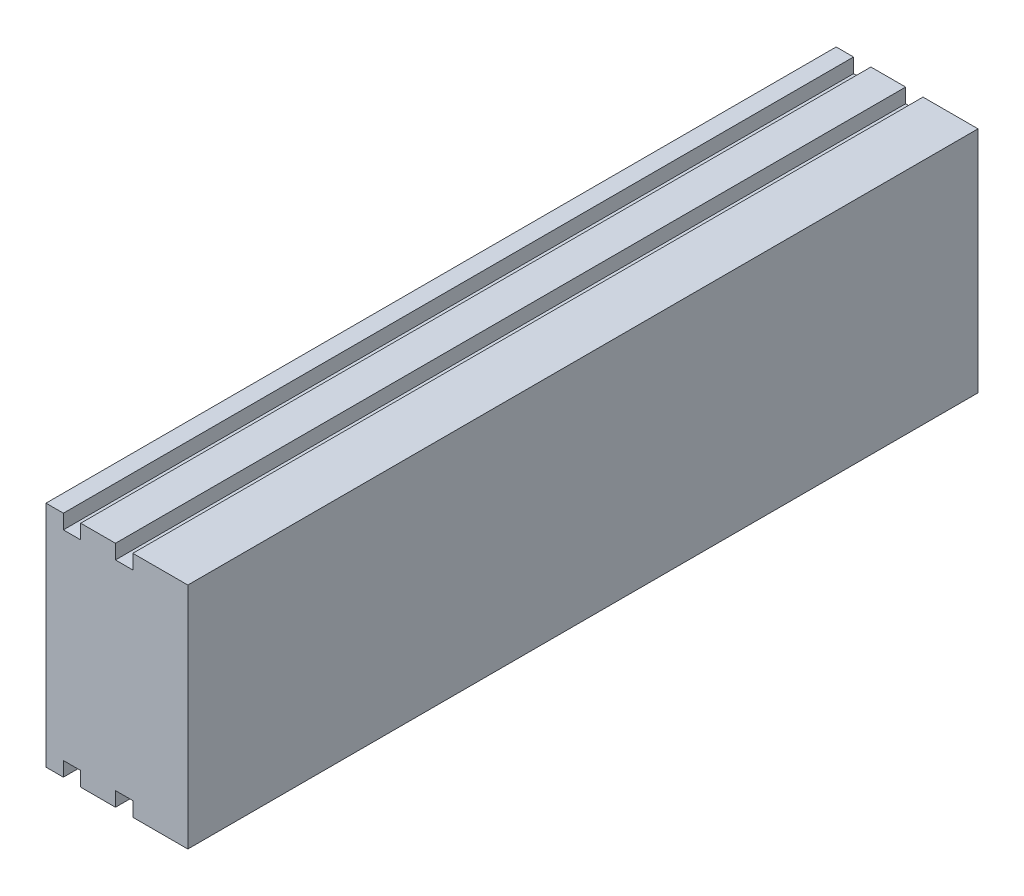
ISO-10303-21;
HEADER;
FILE_DESCRIPTION(('STEP AP214'),'2;1');
FILE_NAME('part.step','',(''),(''),'','','');
FILE_SCHEMA(('AUTOMOTIVE_DESIGN { 1 0 10303 214 1 1 1 1 }'));
ENDSEC;
DATA;
#1=APPLICATION_CONTEXT('core data for automotive mechanical design processes');
#2=APPLICATION_PROTOCOL_DEFINITION('international standard','automotive_design',2000,#1);
#3=PRODUCT_CONTEXT('',#1,'mechanical');
#4=PRODUCT('Part','Part','',(#3));
#5=PRODUCT_RELATED_PRODUCT_CATEGORY('part','',(#4));
#6=PRODUCT_DEFINITION_FORMATION('','',#4);
#7=PRODUCT_DEFINITION_CONTEXT('part definition',#1,'design');
#8=PRODUCT_DEFINITION('design','',#6,#7);
#9=PRODUCT_DEFINITION_SHAPE('','',#8);
#10=(LENGTH_UNIT() NAMED_UNIT(*) SI_UNIT(.MILLI.,.METRE.));
#11=(NAMED_UNIT(*) PLANE_ANGLE_UNIT() SI_UNIT($,.RADIAN.));
#12=(NAMED_UNIT(*) SI_UNIT($,.STERADIAN.) SOLID_ANGLE_UNIT());
#13=UNCERTAINTY_MEASURE_WITH_UNIT(LENGTH_MEASURE(1.E-05),#10,'distance_accuracy_value','');
#14=(GEOMETRIC_REPRESENTATION_CONTEXT(3) GLOBAL_UNCERTAINTY_ASSIGNED_CONTEXT((#13)) GLOBAL_UNIT_ASSIGNED_CONTEXT((#10,
#11,#12)) REPRESENTATION_CONTEXT('',''));
#15=CARTESIAN_POINT('',(0.,0.,0.));
#16=DIRECTION('',(0.,0.,1.));
#17=DIRECTION('',(1.,0.,0.));
#18=AXIS2_PLACEMENT_3D('',#15,#16,#17);
#19=CARTESIAN_POINT('',(0.,79.,273.));
#20=DIRECTION('',(0.,-1.,0.));
#21=DIRECTION('',(0.,0.,-1.));
#22=AXIS2_PLACEMENT_3D('',#19,#20,#21);
#23=PLANE('',#22);
#24=DIRECTION('',(0.,0.,-1.));
#25=VECTOR('',#24,1.);
#26=CARTESIAN_POINT('',(6.,79.,273.));
#27=LINE('',#26,#25);
#28=CARTESIAN_POINT('',(6.,79.,273.));
#29=VERTEX_POINT('',#28);
#30=CARTESIAN_POINT('',(6.00000000000003,79.,0.));
#31=VERTEX_POINT('',#30);
#32=EDGE_CURVE('E183',#29,#31,#27,.T.);
#33=ORIENTED_EDGE('',*,*,#32,.T.);
#34=DIRECTION('',(-1.,0.,0.));
#35=VECTOR('',#34,1.);
#36=CARTESIAN_POINT('',(0.,79.,0.));
#37=LINE('',#36,#35);
#38=CARTESIAN_POINT('',(0.,79.,0.));
#39=VERTEX_POINT('',#38);
#40=EDGE_CURVE('E361',#31,#39,#37,.T.);
#41=ORIENTED_EDGE('',*,*,#40,.T.);
#42=DIRECTION('',(0.,0.,-1.));
#43=VECTOR('',#42,1.);
#44=CARTESIAN_POINT('',(0.,79.,273.));
#45=LINE('',#44,#43);
#46=CARTESIAN_POINT('',(0.,79.,273.));
#47=VERTEX_POINT('',#46);
#48=EDGE_CURVE('E347',#47,#39,#45,.T.);
#49=ORIENTED_EDGE('',*,*,#48,.F.);
#50=DIRECTION('',(-1.,0.,0.));
#51=VECTOR('',#50,1.);
#52=CARTESIAN_POINT('',(0.,79.,273.));
#53=LINE('',#52,#51);
#54=EDGE_CURVE('E342',#29,#47,#53,.T.);
#55=ORIENTED_EDGE('',*,*,#54,.F.);
#56=EDGE_LOOP('',(#33,#41,#49,#55));
#57=FACE_BOUND('',#56,.T.);
#58=ADVANCED_FACE('F39',(#57),#23,.F.);
#59=DIRECTION('',(0.,0.,1.));
#60=VECTOR('',#59,1.);
#61=CARTESIAN_POINT('',(12.,79.,273.));
#62=LINE('',#61,#60);
#63=CARTESIAN_POINT('',(12.,79.,0.));
#64=VERTEX_POINT('',#63);
#65=CARTESIAN_POINT('',(12.,79.,273.));
#66=VERTEX_POINT('',#65);
#67=EDGE_CURVE('E196',#64,#66,#62,.T.);
#68=ORIENTED_EDGE('',*,*,#67,.T.);
#69=CARTESIAN_POINT('',(24.,79.,273.));
#70=VERTEX_POINT('',#69);
#71=EDGE_CURVE('E348',#70,#66,#53,.T.);
#72=ORIENTED_EDGE('',*,*,#71,.F.);
#73=DIRECTION('',(0.,0.,-1.));
#74=VECTOR('',#73,1.);
#75=CARTESIAN_POINT('',(24.,79.,273.));
#76=LINE('',#75,#74);
#77=CARTESIAN_POINT('',(24.,79.,0.));
#78=VERTEX_POINT('',#77);
#79=EDGE_CURVE('E239',#70,#78,#76,.T.);
#80=ORIENTED_EDGE('',*,*,#79,.T.);
#81=EDGE_CURVE('E365',#78,#64,#37,.T.);
#82=ORIENTED_EDGE('',*,*,#81,.T.);
#83=EDGE_LOOP('',(#68,#72,#80,#82));
#84=FACE_BOUND('',#83,.T.);
#85=ADVANCED_FACE('F423',(#84),#23,.F.);
#86=DIRECTION('',(0.,0.,1.));
#87=VECTOR('',#86,1.);
#88=CARTESIAN_POINT('',(30.,79.,273.));
#89=LINE('',#88,#87);
#90=CARTESIAN_POINT('',(30.,79.,0.));
#91=VERTEX_POINT('',#90);
#92=CARTESIAN_POINT('',(30.,79.,273.));
#93=VERTEX_POINT('',#92);
#94=EDGE_CURVE('E228',#91,#93,#89,.T.);
#95=ORIENTED_EDGE('',*,*,#94,.T.);
#96=CARTESIAN_POINT('',(49.,79.,273.));
#97=VERTEX_POINT('',#96);
#98=EDGE_CURVE('E343',#97,#93,#53,.T.);
#99=ORIENTED_EDGE('',*,*,#98,.F.);
#100=DIRECTION('',(0.,0.,-1.));
#101=VECTOR('',#100,1.);
#102=CARTESIAN_POINT('',(49.,79.,273.));
#103=LINE('',#102,#101);
#104=CARTESIAN_POINT('',(49.,79.,0.));
#105=VERTEX_POINT('',#104);
#106=EDGE_CURVE('E369',#97,#105,#103,.T.);
#107=ORIENTED_EDGE('',*,*,#106,.T.);
#108=EDGE_CURVE('E333',#105,#91,#37,.T.);
#109=ORIENTED_EDGE('',*,*,#108,.T.);
#110=EDGE_LOOP('',(#95,#99,#107,#109));
#111=FACE_BOUND('',#110,.T.);
#112=ADVANCED_FACE('F389',(#111),#23,.F.);
#113=CARTESIAN_POINT('',(0.,0.,273.));
#114=DIRECTION('',(0.,0.,-1.));
#115=DIRECTION('',(-1.,0.,0.));
#116=AXIS2_PLACEMENT_3D('',#113,#114,#115);
#117=PLANE('',#116);
#118=DIRECTION('',(0.,1.,0.));
#119=VECTOR('',#118,1.);
#120=CARTESIAN_POINT('',(6.,74.,273.));
#121=LINE('',#120,#119);
#122=CARTESIAN_POINT('',(6.,74.,273.));
#123=VERTEX_POINT('',#122);
#124=EDGE_CURVE('E177',#123,#29,#121,.T.);
#125=ORIENTED_EDGE('',*,*,#124,.T.);
#126=ORIENTED_EDGE('',*,*,#54,.T.);
#127=DIRECTION('',(0.,-1.,0.));
#128=VECTOR('',#127,1.);
#129=CARTESIAN_POINT('',(0.,0.,273.));
#130=LINE('',#129,#128);
#131=CARTESIAN_POINT('',(0.,0.,273.));
#132=VERTEX_POINT('',#131);
#133=EDGE_CURVE('E328',#47,#132,#130,.T.);
#134=ORIENTED_EDGE('',*,*,#133,.T.);
#135=DIRECTION('',(1.,0.,0.));
#136=VECTOR('',#135,1.);
#137=CARTESIAN_POINT('',(0.,0.,273.));
#138=LINE('',#137,#136);
#139=CARTESIAN_POINT('',(6.,0.,273.));
#140=VERTEX_POINT('',#139);
#141=EDGE_CURVE('E334',#132,#140,#138,.T.);
#142=ORIENTED_EDGE('',*,*,#141,.T.);
#143=DIRECTION('',(0.,-1.,0.));
#144=VECTOR('',#143,1.);
#145=CARTESIAN_POINT('',(6.,5.,273.));
#146=LINE('',#145,#144);
#147=CARTESIAN_POINT('',(6.,5.,273.));
#148=VERTEX_POINT('',#147);
#149=EDGE_CURVE('E281',#148,#140,#146,.T.);
#150=ORIENTED_EDGE('',*,*,#149,.F.);
#151=DIRECTION('',(-1.,0.,0.));
#152=VECTOR('',#151,1.);
#153=CARTESIAN_POINT('',(6.,5.,273.));
#154=LINE('',#153,#152);
#155=CARTESIAN_POINT('',(12.,5.,273.));
#156=VERTEX_POINT('',#155);
#157=EDGE_CURVE('E270',#156,#148,#154,.T.);
#158=ORIENTED_EDGE('',*,*,#157,.F.);
#159=DIRECTION('',(0.,-1.,0.));
#160=VECTOR('',#159,1.);
#161=CARTESIAN_POINT('',(12.,5.,273.));
#162=LINE('',#161,#160);
#163=CARTESIAN_POINT('',(12.,0.,273.));
#164=VERTEX_POINT('',#163);
#165=EDGE_CURVE('E285',#156,#164,#162,.T.);
#166=ORIENTED_EDGE('',*,*,#165,.T.);
#167=CARTESIAN_POINT('',(24.,0.,273.));
#168=VERTEX_POINT('',#167);
#169=EDGE_CURVE('E339',#164,#168,#138,.T.);
#170=ORIENTED_EDGE('',*,*,#169,.T.);
#171=DIRECTION('',(0.,-1.,0.));
#172=VECTOR('',#171,1.);
#173=CARTESIAN_POINT('',(24.,5.,273.));
#174=LINE('',#173,#172);
#175=CARTESIAN_POINT('',(24.,5.,273.));
#176=VERTEX_POINT('',#175);
#177=EDGE_CURVE('E278',#176,#168,#174,.T.);
#178=ORIENTED_EDGE('',*,*,#177,.F.);
#179=DIRECTION('',(-1.,0.,0.));
#180=VECTOR('',#179,1.);
#181=CARTESIAN_POINT('',(24.,5.,273.));
#182=LINE('',#181,#180);
#183=CARTESIAN_POINT('',(30.,5.,273.));
#184=VERTEX_POINT('',#183);
#185=EDGE_CURVE('E307',#184,#176,#182,.T.);
#186=ORIENTED_EDGE('',*,*,#185,.F.);
#187=DIRECTION('',(0.,-1.,0.));
#188=VECTOR('',#187,1.);
#189=CARTESIAN_POINT('',(30.,5.,273.));
#190=LINE('',#189,#188);
#191=CARTESIAN_POINT('',(30.,0.,273.));
#192=VERTEX_POINT('',#191);
#193=EDGE_CURVE('E318',#184,#192,#190,.T.);
#194=ORIENTED_EDGE('',*,*,#193,.T.);
#195=CARTESIAN_POINT('',(49.,0.,273.));
#196=VERTEX_POINT('',#195);
#197=EDGE_CURVE('E332',#192,#196,#138,.T.);
#198=ORIENTED_EDGE('',*,*,#197,.T.);
#199=DIRECTION('',(0.,1.,0.));
#200=VECTOR('',#199,1.);
#201=CARTESIAN_POINT('',(49.,0.,273.));
#202=LINE('',#201,#200);
#203=EDGE_CURVE('E338',#196,#97,#202,.T.);
#204=ORIENTED_EDGE('',*,*,#203,.T.);
#205=ORIENTED_EDGE('',*,*,#98,.T.);
#206=DIRECTION('',(0.,1.,0.));
#207=VECTOR('',#206,1.);
#208=CARTESIAN_POINT('',(30.,74.,273.));
#209=LINE('',#208,#207);
#210=CARTESIAN_POINT('',(30.,74.,273.));
#211=VERTEX_POINT('',#210);
#212=EDGE_CURVE('E252',#211,#93,#209,.T.);
#213=ORIENTED_EDGE('',*,*,#212,.F.);
#214=DIRECTION('',(-1.,0.,0.));
#215=VECTOR('',#214,1.);
#216=CARTESIAN_POINT('',(24.,74.,273.));
#217=LINE('',#216,#215);
#218=CARTESIAN_POINT('',(24.,74.,273.));
#219=VERTEX_POINT('',#218);
#220=EDGE_CURVE('E227',#211,#219,#217,.T.);
#221=ORIENTED_EDGE('',*,*,#220,.T.);
#222=DIRECTION('',(0.,1.,0.));
#223=VECTOR('',#222,1.);
#224=CARTESIAN_POINT('',(24.,74.,273.));
#225=LINE('',#224,#223);
#226=EDGE_CURVE('E238',#219,#70,#225,.T.);
#227=ORIENTED_EDGE('',*,*,#226,.T.);
#228=ORIENTED_EDGE('',*,*,#71,.T.);
#229=DIRECTION('',(0.,1.,0.));
#230=VECTOR('',#229,1.);
#231=CARTESIAN_POINT('',(12.,74.,273.));
#232=LINE('',#231,#230);
#233=CARTESIAN_POINT('',(12.,74.,273.));
#234=VERTEX_POINT('',#233);
#235=EDGE_CURVE('E188',#234,#66,#232,.T.);
#236=ORIENTED_EDGE('',*,*,#235,.F.);
#237=DIRECTION('',(-1.,0.,0.));
#238=VECTOR('',#237,1.);
#239=CARTESIAN_POINT('',(6.,74.,273.));
#240=LINE('',#239,#238);
#241=EDGE_CURVE('E192',#234,#123,#240,.T.);
#242=ORIENTED_EDGE('',*,*,#241,.T.);
#243=EDGE_LOOP('',(#125,#126,#134,#142,#150,#158,#166,#170,#178,#186,#194,#198,#204,#205,#213,
#221,#227,#228,#236,#242));
#244=FACE_BOUND('',#243,.T.);
#245=ADVANCED_FACE('F198',(#244),#117,.F.);
#246=CARTESIAN_POINT('',(0.,0.,0.));
#247=DIRECTION('',(0.,0.,-1.));
#248=DIRECTION('',(-1.,0.,0.));
#249=AXIS2_PLACEMENT_3D('',#246,#247,#248);
#250=PLANE('',#249);
#251=ORIENTED_EDGE('',*,*,#40,.F.);
#252=DIRECTION('',(0.,1.,0.));
#253=VECTOR('',#252,1.);
#254=CARTESIAN_POINT('',(6.00000000000003,74.,0.));
#255=LINE('',#254,#253);
#256=CARTESIAN_POINT('',(6.00000000000003,74.,0.));
#257=VERTEX_POINT('',#256);
#258=EDGE_CURVE('E213',#257,#31,#255,.T.);
#259=ORIENTED_EDGE('',*,*,#258,.F.);
#260=DIRECTION('',(1.,0.,0.));
#261=VECTOR('',#260,1.);
#262=CARTESIAN_POINT('',(6.00000000000003,74.,0.));
#263=LINE('',#262,#261);
#264=CARTESIAN_POINT('',(12.,74.,0.));
#265=VERTEX_POINT('',#264);
#266=EDGE_CURVE('E189',#257,#265,#263,.T.);
#267=ORIENTED_EDGE('',*,*,#266,.T.);
#268=DIRECTION('',(0.,1.,0.));
#269=VECTOR('',#268,1.);
#270=CARTESIAN_POINT('',(12.,74.,0.));
#271=LINE('',#270,#269);
#272=EDGE_CURVE('E217',#265,#64,#271,.T.);
#273=ORIENTED_EDGE('',*,*,#272,.T.);
#274=ORIENTED_EDGE('',*,*,#81,.F.);
#275=DIRECTION('',(0.,1.,0.));
#276=VECTOR('',#275,1.);
#277=CARTESIAN_POINT('',(24.,74.,0.));
#278=LINE('',#277,#276);
#279=CARTESIAN_POINT('',(24.,74.,0.));
#280=VERTEX_POINT('',#279);
#281=EDGE_CURVE('E209',#280,#78,#278,.T.);
#282=ORIENTED_EDGE('',*,*,#281,.F.);
#283=DIRECTION('',(1.,0.,0.));
#284=VECTOR('',#283,1.);
#285=CARTESIAN_POINT('',(24.,74.,0.));
#286=LINE('',#285,#284);
#287=CARTESIAN_POINT('',(30.,74.,0.));
#288=VERTEX_POINT('',#287);
#289=EDGE_CURVE('E234',#280,#288,#286,.T.);
#290=ORIENTED_EDGE('',*,*,#289,.T.);
#291=DIRECTION('',(0.,1.,0.));
#292=VECTOR('',#291,1.);
#293=CARTESIAN_POINT('',(30.,74.,0.));
#294=LINE('',#293,#292);
#295=EDGE_CURVE('E248',#288,#91,#294,.T.);
#296=ORIENTED_EDGE('',*,*,#295,.T.);
#297=ORIENTED_EDGE('',*,*,#108,.F.);
#298=DIRECTION('',(0.,1.,0.));
#299=VECTOR('',#298,1.);
#300=CARTESIAN_POINT('',(49.,0.,0.));
#301=LINE('',#300,#299);
#302=CARTESIAN_POINT('',(49.,0.,0.));
#303=VERTEX_POINT('',#302);
#304=EDGE_CURVE('E357',#303,#105,#301,.T.);
#305=ORIENTED_EDGE('',*,*,#304,.F.);
#306=DIRECTION('',(1.,0.,0.));
#307=VECTOR('',#306,1.);
#308=CARTESIAN_POINT('',(0.,0.,0.));
#309=LINE('',#308,#307);
#310=CARTESIAN_POINT('',(30.,0.,0.));
#311=VERTEX_POINT('',#310);
#312=EDGE_CURVE('E352',#311,#303,#309,.T.);
#313=ORIENTED_EDGE('',*,*,#312,.F.);
#314=DIRECTION('',(0.,-1.,0.));
#315=VECTOR('',#314,1.);
#316=CARTESIAN_POINT('',(30.,5.,0.));
#317=LINE('',#316,#315);
#318=CARTESIAN_POINT('',(30.,5.,0.));
#319=VERTEX_POINT('',#318);
#320=EDGE_CURVE('E322',#319,#311,#317,.T.);
#321=ORIENTED_EDGE('',*,*,#320,.F.);
#322=DIRECTION('',(1.,0.,0.));
#323=VECTOR('',#322,1.);
#324=CARTESIAN_POINT('',(24.,5.,0.));
#325=LINE('',#324,#323);
#326=CARTESIAN_POINT('',(24.,5.,0.));
#327=VERTEX_POINT('',#326);
#328=EDGE_CURVE('E298',#327,#319,#325,.T.);
#329=ORIENTED_EDGE('',*,*,#328,.F.);
#330=DIRECTION('',(0.,-1.,0.));
#331=VECTOR('',#330,1.);
#332=CARTESIAN_POINT('',(24.,5.,0.));
#333=LINE('',#332,#331);
#334=CARTESIAN_POINT('',(24.,0.,0.));
#335=VERTEX_POINT('',#334);
#336=EDGE_CURVE('E311',#327,#335,#333,.T.);
#337=ORIENTED_EDGE('',*,*,#336,.T.);
#338=CARTESIAN_POINT('',(12.,0.,0.));
#339=VERTEX_POINT('',#338);
#340=EDGE_CURVE('E358',#339,#335,#309,.T.);
#341=ORIENTED_EDGE('',*,*,#340,.F.);
#342=DIRECTION('',(0.,-1.,0.));
#343=VECTOR('',#342,1.);
#344=CARTESIAN_POINT('',(12.,5.,0.));
#345=LINE('',#344,#343);
#346=CARTESIAN_POINT('',(12.,5.,0.));
#347=VERTEX_POINT('',#346);
#348=EDGE_CURVE('E289',#347,#339,#345,.T.);
#349=ORIENTED_EDGE('',*,*,#348,.F.);
#350=DIRECTION('',(1.,0.,0.));
#351=VECTOR('',#350,1.);
#352=CARTESIAN_POINT('',(6.00000000000003,5.,0.));
#353=LINE('',#352,#351);
#354=CARTESIAN_POINT('',(6.,5.,0.));
#355=VERTEX_POINT('',#354);
#356=EDGE_CURVE('E261',#355,#347,#353,.T.);
#357=ORIENTED_EDGE('',*,*,#356,.F.);
#358=DIRECTION('',(0.,-1.,0.));
#359=VECTOR('',#358,1.);
#360=CARTESIAN_POINT('',(6.00000000000003,5.,0.));
#361=LINE('',#360,#359);
#362=CARTESIAN_POINT('',(6.00000000000003,0.,0.));
#363=VERTEX_POINT('',#362);
#364=EDGE_CURVE('E274',#355,#363,#361,.T.);
#365=ORIENTED_EDGE('',*,*,#364,.T.);
#366=CARTESIAN_POINT('',(0.,0.,0.));
#367=VERTEX_POINT('',#366);
#368=EDGE_CURVE('E353',#367,#363,#309,.T.);
#369=ORIENTED_EDGE('',*,*,#368,.F.);
#370=DIRECTION('',(0.,-1.,0.));
#371=VECTOR('',#370,1.);
#372=CARTESIAN_POINT('',(0.,0.,0.));
#373=LINE('',#372,#371);
#374=EDGE_CURVE('E284',#39,#367,#373,.T.);
#375=ORIENTED_EDGE('',*,*,#374,.F.);
#376=EDGE_LOOP('',(#251,#259,#267,#273,#274,#282,#290,#296,#297,#305,#313,#321,#329,#337,#341,
#349,#357,#365,#369,#375));
#377=FACE_BOUND('',#376,.T.);
#378=ADVANCED_FACE('F386',(#377),#250,.T.);
#379=CARTESIAN_POINT('',(0.,0.,273.));
#380=DIRECTION('',(0.,1.,0.));
#381=DIRECTION('',(0.,0.,1.));
#382=AXIS2_PLACEMENT_3D('',#379,#380,#381);
#383=PLANE('',#382);
#384=ORIENTED_EDGE('',*,*,#368,.T.);
#385=DIRECTION('',(0.,0.,-1.));
#386=VECTOR('',#385,1.);
#387=CARTESIAN_POINT('',(6.,0.,273.));
#388=LINE('',#387,#386);
#389=EDGE_CURVE('E275',#140,#363,#388,.T.);
#390=ORIENTED_EDGE('',*,*,#389,.F.);
#391=ORIENTED_EDGE('',*,*,#141,.F.);
#392=DIRECTION('',(0.,0.,-1.));
#393=VECTOR('',#392,1.);
#394=CARTESIAN_POINT('',(0.,0.,273.));
#395=LINE('',#394,#393);
#396=EDGE_CURVE('E11',#132,#367,#395,.T.);
#397=ORIENTED_EDGE('',*,*,#396,.T.);
#398=EDGE_LOOP('',(#384,#390,#391,#397));
#399=FACE_BOUND('',#398,.T.);
#400=ADVANCED_FACE('F453',(#399),#383,.F.);
#401=ORIENTED_EDGE('',*,*,#169,.F.);
#402=DIRECTION('',(0.,0.,1.));
#403=VECTOR('',#402,1.);
#404=CARTESIAN_POINT('',(12.,0.,273.));
#405=LINE('',#404,#403);
#406=EDGE_CURVE('E262',#339,#164,#405,.T.);
#407=ORIENTED_EDGE('',*,*,#406,.F.);
#408=ORIENTED_EDGE('',*,*,#340,.T.);
#409=DIRECTION('',(0.,0.,-1.));
#410=VECTOR('',#409,1.);
#411=CARTESIAN_POINT('',(24.,0.,273.));
#412=LINE('',#411,#410);
#413=EDGE_CURVE('E216',#168,#335,#412,.T.);
#414=ORIENTED_EDGE('',*,*,#413,.F.);
#415=EDGE_LOOP('',(#401,#407,#408,#414));
#416=FACE_BOUND('',#415,.T.);
#417=ADVANCED_FACE('F403',(#416),#383,.F.);
#418=CARTESIAN_POINT('',(0.,0.,273.));
#419=DIRECTION('',(1.,0.,0.));
#420=DIRECTION('',(0.,1.,0.));
#421=AXIS2_PLACEMENT_3D('',#418,#419,#420);
#422=PLANE('',#421);
#423=ORIENTED_EDGE('',*,*,#374,.T.);
#424=ORIENTED_EDGE('',*,*,#396,.F.);
#425=ORIENTED_EDGE('',*,*,#133,.F.);
#426=ORIENTED_EDGE('',*,*,#48,.T.);
#427=EDGE_LOOP('',(#423,#424,#425,#426));
#428=FACE_BOUND('',#427,.T.);
#429=ADVANCED_FACE('F41',(#428),#422,.F.);
#430=ORIENTED_EDGE('',*,*,#197,.F.);
#431=DIRECTION('',(0.,0.,1.));
#432=VECTOR('',#431,1.);
#433=CARTESIAN_POINT('',(30.,0.,273.));
#434=LINE('',#433,#432);
#435=EDGE_CURVE('E299',#311,#192,#434,.T.);
#436=ORIENTED_EDGE('',*,*,#435,.F.);
#437=ORIENTED_EDGE('',*,*,#312,.T.);
#438=DIRECTION('',(0.,0.,-1.));
#439=VECTOR('',#438,1.);
#440=CARTESIAN_POINT('',(49.,0.,273.));
#441=LINE('',#440,#439);
#442=EDGE_CURVE('E48',#196,#303,#441,.T.);
#443=ORIENTED_EDGE('',*,*,#442,.F.);
#444=EDGE_LOOP('',(#430,#436,#437,#443));
#445=FACE_BOUND('',#444,.T.);
#446=ADVANCED_FACE('F415',(#445),#383,.F.);
#447=CARTESIAN_POINT('',(49.,0.,273.));
#448=DIRECTION('',(-1.,0.,0.));
#449=DIRECTION('',(0.,-1.,0.));
#450=AXIS2_PLACEMENT_3D('',#447,#448,#449);
#451=PLANE('',#450);
#452=ORIENTED_EDGE('',*,*,#304,.T.);
#453=ORIENTED_EDGE('',*,*,#106,.F.);
#454=ORIENTED_EDGE('',*,*,#203,.F.);
#455=ORIENTED_EDGE('',*,*,#442,.T.);
#456=EDGE_LOOP('',(#452,#453,#454,#455));
#457=FACE_BOUND('',#456,.T.);
#458=ADVANCED_FACE('F378',(#457),#451,.F.);
#459=CARTESIAN_POINT('',(24.,5.,273.));
#460=DIRECTION('',(-1.,0.,0.));
#461=DIRECTION('',(0.,0.,1.));
#462=AXIS2_PLACEMENT_3D('',#459,#460,#461);
#463=PLANE('',#462);
#464=ORIENTED_EDGE('',*,*,#413,.T.);
#465=ORIENTED_EDGE('',*,*,#336,.F.);
#466=DIRECTION('',(0.,0.,-1.));
#467=VECTOR('',#466,1.);
#468=CARTESIAN_POINT('',(24.,5.,273.));
#469=LINE('',#468,#467);
#470=EDGE_CURVE('E295',#176,#327,#469,.T.);
#471=ORIENTED_EDGE('',*,*,#470,.F.);
#472=ORIENTED_EDGE('',*,*,#177,.T.);
#473=EDGE_LOOP('',(#464,#465,#471,#472));
#474=FACE_BOUND('',#473,.T.);
#475=ADVANCED_FACE('F408',(#474),#463,.F.);
#476=CARTESIAN_POINT('',(30.,5.,273.));
#477=DIRECTION('',(1.,0.,0.));
#478=DIRECTION('',(0.,0.,-1.));
#479=AXIS2_PLACEMENT_3D('',#476,#477,#478);
#480=PLANE('',#479);
#481=ORIENTED_EDGE('',*,*,#435,.T.);
#482=ORIENTED_EDGE('',*,*,#193,.F.);
#483=DIRECTION('',(0.,0.,1.));
#484=VECTOR('',#483,1.);
#485=CARTESIAN_POINT('',(30.,5.,273.));
#486=LINE('',#485,#484);
#487=EDGE_CURVE('E303',#319,#184,#486,.T.);
#488=ORIENTED_EDGE('',*,*,#487,.F.);
#489=ORIENTED_EDGE('',*,*,#320,.T.);
#490=EDGE_LOOP('',(#481,#482,#488,#489));
#491=FACE_BOUND('',#490,.T.);
#492=ADVANCED_FACE('F414',(#491),#480,.F.);
#493=CARTESIAN_POINT('',(0.,5.,0.));
#494=DIRECTION('',(0.,-1.,0.));
#495=DIRECTION('',(0.,0.,-1.));
#496=AXIS2_PLACEMENT_3D('',#493,#494,#495);
#497=PLANE('',#496);
#498=ORIENTED_EDGE('',*,*,#470,.T.);
#499=ORIENTED_EDGE('',*,*,#328,.T.);
#500=ORIENTED_EDGE('',*,*,#487,.T.);
#501=ORIENTED_EDGE('',*,*,#185,.T.);
#502=EDGE_LOOP('',(#498,#499,#500,#501));
#503=FACE_BOUND('',#502,.T.);
#504=ADVANCED_FACE('F412',(#503),#497,.T.);
#505=CARTESIAN_POINT('',(6.,5.,273.));
#506=DIRECTION('',(-1.,0.,0.));
#507=DIRECTION('',(0.,0.,1.));
#508=AXIS2_PLACEMENT_3D('',#505,#506,#507);
#509=PLANE('',#508);
#510=ORIENTED_EDGE('',*,*,#389,.T.);
#511=ORIENTED_EDGE('',*,*,#364,.F.);
#512=DIRECTION('',(0.,0.,-1.));
#513=VECTOR('',#512,1.);
#514=CARTESIAN_POINT('',(6.,5.,273.));
#515=LINE('',#514,#513);
#516=EDGE_CURVE('E258',#148,#355,#515,.T.);
#517=ORIENTED_EDGE('',*,*,#516,.F.);
#518=ORIENTED_EDGE('',*,*,#149,.T.);
#519=EDGE_LOOP('',(#510,#511,#517,#518));
#520=FACE_BOUND('',#519,.T.);
#521=ADVANCED_FACE('F461',(#520),#509,.F.);
#522=CARTESIAN_POINT('',(12.,5.,273.));
#523=DIRECTION('',(1.,0.,0.));
#524=DIRECTION('',(0.,0.,-1.));
#525=AXIS2_PLACEMENT_3D('',#522,#523,#524);
#526=PLANE('',#525);
#527=ORIENTED_EDGE('',*,*,#406,.T.);
#528=ORIENTED_EDGE('',*,*,#165,.F.);
#529=DIRECTION('',(0.,0.,1.));
#530=VECTOR('',#529,1.);
#531=CARTESIAN_POINT('',(12.,5.,273.));
#532=LINE('',#531,#530);
#533=EDGE_CURVE('E266',#347,#156,#532,.T.);
#534=ORIENTED_EDGE('',*,*,#533,.F.);
#535=ORIENTED_EDGE('',*,*,#348,.T.);
#536=EDGE_LOOP('',(#527,#528,#534,#535));
#537=FACE_BOUND('',#536,.T.);
#538=ADVANCED_FACE('F464',(#537),#526,.F.);
#539=CARTESIAN_POINT('',(0.,5.,0.));
#540=DIRECTION('',(0.,-1.,0.));
#541=DIRECTION('',(0.,0.,-1.));
#542=AXIS2_PLACEMENT_3D('',#539,#540,#541);
#543=PLANE('',#542);
#544=ORIENTED_EDGE('',*,*,#516,.T.);
#545=ORIENTED_EDGE('',*,*,#356,.T.);
#546=ORIENTED_EDGE('',*,*,#533,.T.);
#547=ORIENTED_EDGE('',*,*,#157,.T.);
#548=EDGE_LOOP('',(#544,#545,#546,#547));
#549=FACE_BOUND('',#548,.T.);
#550=ADVANCED_FACE('F468',(#549),#543,.T.);
#551=CARTESIAN_POINT('',(24.,74.,273.));
#552=DIRECTION('',(1.,0.,0.));
#553=DIRECTION('',(0.,0.,-1.));
#554=AXIS2_PLACEMENT_3D('',#551,#552,#553);
#555=PLANE('',#554);
#556=ORIENTED_EDGE('',*,*,#79,.F.);
#557=ORIENTED_EDGE('',*,*,#226,.F.);
#558=DIRECTION('',(0.,0.,-1.));
#559=VECTOR('',#558,1.);
#560=CARTESIAN_POINT('',(24.,74.,273.));
#561=LINE('',#560,#559);
#562=EDGE_CURVE('E223',#219,#280,#561,.T.);
#563=ORIENTED_EDGE('',*,*,#562,.T.);
#564=ORIENTED_EDGE('',*,*,#281,.T.);
#565=EDGE_LOOP('',(#556,#557,#563,#564));
#566=FACE_BOUND('',#565,.T.);
#567=ADVANCED_FACE('F472',(#566),#555,.T.);
#568=CARTESIAN_POINT('',(30.,74.,273.));
#569=DIRECTION('',(-1.,0.,0.));
#570=DIRECTION('',(0.,0.,1.));
#571=AXIS2_PLACEMENT_3D('',#568,#569,#570);
#572=PLANE('',#571);
#573=ORIENTED_EDGE('',*,*,#94,.F.);
#574=ORIENTED_EDGE('',*,*,#295,.F.);
#575=DIRECTION('',(0.,0.,1.));
#576=VECTOR('',#575,1.);
#577=CARTESIAN_POINT('',(30.,74.,273.));
#578=LINE('',#577,#576);
#579=EDGE_CURVE('E63',#288,#211,#578,.T.);
#580=ORIENTED_EDGE('',*,*,#579,.T.);
#581=ORIENTED_EDGE('',*,*,#212,.T.);
#582=EDGE_LOOP('',(#573,#574,#580,#581));
#583=FACE_BOUND('',#582,.T.);
#584=ADVANCED_FACE('F476',(#583),#572,.T.);
#585=CARTESIAN_POINT('',(0.,74.,0.));
#586=DIRECTION('',(0.,1.,0.));
#587=DIRECTION('',(0.,0.,-1.));
#588=AXIS2_PLACEMENT_3D('',#585,#586,#587);
#589=PLANE('',#588);
#590=ORIENTED_EDGE('',*,*,#562,.F.);
#591=ORIENTED_EDGE('',*,*,#220,.F.);
#592=ORIENTED_EDGE('',*,*,#579,.F.);
#593=ORIENTED_EDGE('',*,*,#289,.F.);
#594=EDGE_LOOP('',(#590,#591,#592,#593));
#595=FACE_BOUND('',#594,.T.);
#596=ADVANCED_FACE('F435',(#595),#589,.T.);
#597=CARTESIAN_POINT('',(6.,74.,273.));
#598=DIRECTION('',(1.,0.,0.));
#599=DIRECTION('',(0.,0.,-1.));
#600=AXIS2_PLACEMENT_3D('',#597,#598,#599);
#601=PLANE('',#600);
#602=ORIENTED_EDGE('',*,*,#32,.F.);
#603=ORIENTED_EDGE('',*,*,#124,.F.);
#604=DIRECTION('',(0.,0.,-1.));
#605=VECTOR('',#604,1.);
#606=CARTESIAN_POINT('',(6.,74.,273.));
#607=LINE('',#606,#605);
#608=EDGE_CURVE('E180',#123,#257,#607,.T.);
#609=ORIENTED_EDGE('',*,*,#608,.T.);
#610=ORIENTED_EDGE('',*,*,#258,.T.);
#611=EDGE_LOOP('',(#602,#603,#609,#610));
#612=FACE_BOUND('',#611,.T.);
#613=ADVANCED_FACE('F179',(#612),#601,.T.);
#614=CARTESIAN_POINT('',(12.,74.,273.));
#615=DIRECTION('',(-1.,0.,0.));
#616=DIRECTION('',(0.,0.,1.));
#617=AXIS2_PLACEMENT_3D('',#614,#615,#616);
#618=PLANE('',#617);
#619=ORIENTED_EDGE('',*,*,#67,.F.);
#620=ORIENTED_EDGE('',*,*,#272,.F.);
#621=DIRECTION('',(0.,0.,1.));
#622=VECTOR('',#621,1.);
#623=CARTESIAN_POINT('',(12.,74.,273.));
#624=LINE('',#623,#622);
#625=EDGE_CURVE('E55',#265,#234,#624,.T.);
#626=ORIENTED_EDGE('',*,*,#625,.T.);
#627=ORIENTED_EDGE('',*,*,#235,.T.);
#628=EDGE_LOOP('',(#619,#620,#626,#627));
#629=FACE_BOUND('',#628,.T.);
#630=ADVANCED_FACE('F427',(#629),#618,.T.);
#631=CARTESIAN_POINT('',(0.,74.,0.));
#632=DIRECTION('',(0.,1.,0.));
#633=DIRECTION('',(0.,0.,-1.));
#634=AXIS2_PLACEMENT_3D('',#631,#632,#633);
#635=PLANE('',#634);
#636=ORIENTED_EDGE('',*,*,#608,.F.);
#637=ORIENTED_EDGE('',*,*,#241,.F.);
#638=ORIENTED_EDGE('',*,*,#625,.F.);
#639=ORIENTED_EDGE('',*,*,#266,.F.);
#640=EDGE_LOOP('',(#636,#637,#638,#639));
#641=FACE_BOUND('',#640,.T.);
#642=ADVANCED_FACE('F191',(#641),#635,.T.);
#643=CLOSED_SHELL('',(#58,#85,#112,#245,#378,#400,#417,#429,#446,#458,#475,#492,#504,#521,#538,
#550,#567,#584,#596,#613,#630,#642));
#644=MANIFOLD_SOLID_BREP('B2',#643);
#645=ADVANCED_BREP_SHAPE_REPRESENTATION('',(#18,#644),#14);
#646=SHAPE_DEFINITION_REPRESENTATION(#9,#645);
ENDSEC;
END-ISO-10303-21;
